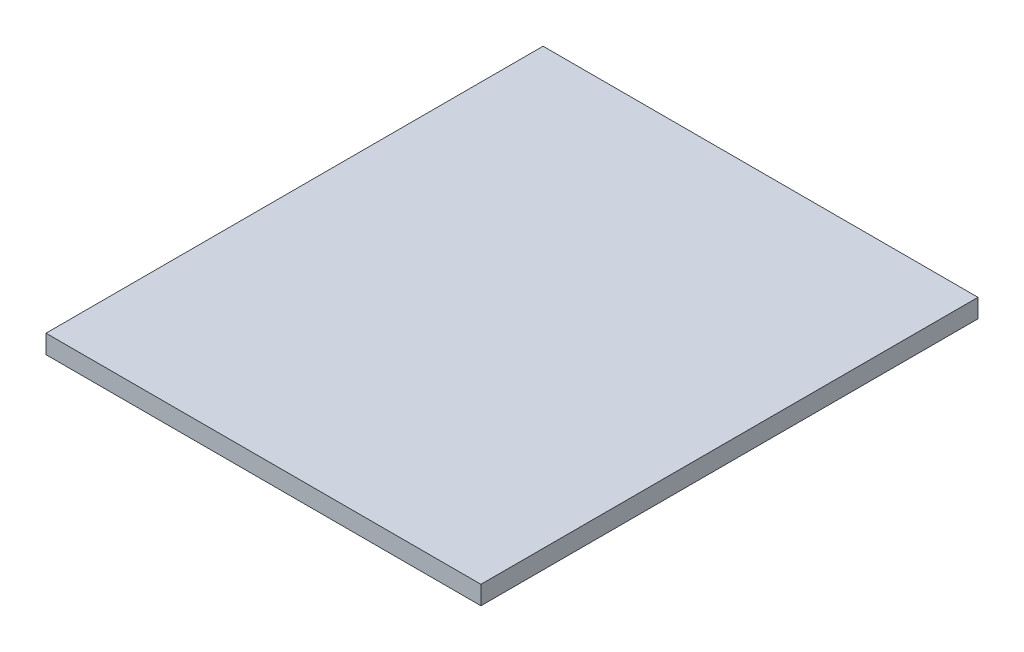
ISO-10303-21;
HEADER;
FILE_DESCRIPTION(('STEP AP214'),'2;1');
FILE_NAME('part.step','',(''),(''),'','','');
FILE_SCHEMA(('AUTOMOTIVE_DESIGN { 1 0 10303 214 1 1 1 1 }'));
ENDSEC;
DATA;
#1=APPLICATION_CONTEXT('core data for automotive mechanical design processes');
#2=APPLICATION_PROTOCOL_DEFINITION('international standard','automotive_design',2000,#1);
#3=PRODUCT_CONTEXT('',#1,'mechanical');
#4=PRODUCT('Part','Part','',(#3));
#5=PRODUCT_RELATED_PRODUCT_CATEGORY('part','',(#4));
#6=PRODUCT_DEFINITION_FORMATION('','',#4);
#7=PRODUCT_DEFINITION_CONTEXT('part definition',#1,'design');
#8=PRODUCT_DEFINITION('design','',#6,#7);
#9=PRODUCT_DEFINITION_SHAPE('','',#8);
#10=(LENGTH_UNIT() NAMED_UNIT(*) SI_UNIT(.MILLI.,.METRE.));
#11=(NAMED_UNIT(*) PLANE_ANGLE_UNIT() SI_UNIT($,.RADIAN.));
#12=(NAMED_UNIT(*) SI_UNIT($,.STERADIAN.) SOLID_ANGLE_UNIT());
#13=UNCERTAINTY_MEASURE_WITH_UNIT(LENGTH_MEASURE(1.E-05),#10,'distance_accuracy_value','');
#14=(GEOMETRIC_REPRESENTATION_CONTEXT(3) GLOBAL_UNCERTAINTY_ASSIGNED_CONTEXT((#13)) GLOBAL_UNIT_ASSIGNED_CONTEXT((#10,
#11,#12)) REPRESENTATION_CONTEXT('',''));
#15=CARTESIAN_POINT('',(0.,0.,0.));
#16=DIRECTION('',(0.,0.,1.));
#17=DIRECTION('',(1.,0.,0.));
#18=AXIS2_PLACEMENT_3D('',#15,#16,#17);
#19=CARTESIAN_POINT('',(-35.,3.,40.));
#20=DIRECTION('',(0.,0.,-1.));
#21=DIRECTION('',(-1.,0.,0.));
#22=AXIS2_PLACEMENT_3D('',#19,#20,#21);
#23=PLANE('',#22);
#24=DIRECTION('',(1.,0.,0.));
#25=VECTOR('',#24,1.);
#26=CARTESIAN_POINT('',(-35.,0.,40.));
#27=LINE('',#26,#25);
#28=CARTESIAN_POINT('',(-35.,0.,40.));
#29=VERTEX_POINT('',#28);
#30=CARTESIAN_POINT('',(35.,0.,40.));
#31=VERTEX_POINT('',#30);
#32=EDGE_CURVE('E96',#29,#31,#27,.T.);
#33=ORIENTED_EDGE('',*,*,#32,.T.);
#34=DIRECTION('',(0.,-1.,0.));
#35=VECTOR('',#34,1.);
#36=CARTESIAN_POINT('',(35.,3.,40.));
#37=LINE('',#36,#35);
#38=CARTESIAN_POINT('',(35.,3.,40.));
#39=VERTEX_POINT('',#38);
#40=EDGE_CURVE('E11',#39,#31,#37,.T.);
#41=ORIENTED_EDGE('',*,*,#40,.F.);
#42=DIRECTION('',(1.,0.,0.));
#43=VECTOR('',#42,1.);
#44=CARTESIAN_POINT('',(-35.,3.,40.));
#45=LINE('',#44,#43);
#46=CARTESIAN_POINT('',(-35.,3.,40.));
#47=VERTEX_POINT('',#46);
#48=EDGE_CURVE('E82',#47,#39,#45,.T.);
#49=ORIENTED_EDGE('',*,*,#48,.F.);
#50=DIRECTION('',(0.,-1.,0.));
#51=VECTOR('',#50,1.);
#52=CARTESIAN_POINT('',(-35.,3.,40.));
#53=LINE('',#52,#51);
#54=EDGE_CURVE('E49',#47,#29,#53,.T.);
#55=ORIENTED_EDGE('',*,*,#54,.T.);
#56=EDGE_LOOP('',(#33,#41,#49,#55));
#57=FACE_BOUND('',#56,.T.);
#58=ADVANCED_FACE('F33',(#57),#23,.F.);
#59=CARTESIAN_POINT('',(35.,3.,40.));
#60=DIRECTION('',(-1.,0.,0.));
#61=DIRECTION('',(0.,0.,1.));
#62=AXIS2_PLACEMENT_3D('',#59,#60,#61);
#63=PLANE('',#62);
#64=DIRECTION('',(0.,0.,-1.));
#65=VECTOR('',#64,1.);
#66=CARTESIAN_POINT('',(35.,0.,40.));
#67=LINE('',#66,#65);
#68=CARTESIAN_POINT('',(35.,0.,-40.));
#69=VERTEX_POINT('',#68);
#70=EDGE_CURVE('E87',#31,#69,#67,.T.);
#71=ORIENTED_EDGE('',*,*,#70,.T.);
#72=DIRECTION('',(0.,-1.,0.));
#73=VECTOR('',#72,1.);
#74=CARTESIAN_POINT('',(35.,3.,-40.));
#75=LINE('',#74,#73);
#76=CARTESIAN_POINT('',(35.,3.,-40.));
#77=VERTEX_POINT('',#76);
#78=EDGE_CURVE('E41',#77,#69,#75,.T.);
#79=ORIENTED_EDGE('',*,*,#78,.F.);
#80=DIRECTION('',(0.,0.,-1.));
#81=VECTOR('',#80,1.);
#82=CARTESIAN_POINT('',(35.,3.,40.));
#83=LINE('',#82,#81);
#84=EDGE_CURVE('E74',#39,#77,#83,.T.);
#85=ORIENTED_EDGE('',*,*,#84,.F.);
#86=ORIENTED_EDGE('',*,*,#40,.T.);
#87=EDGE_LOOP('',(#71,#79,#85,#86));
#88=FACE_BOUND('',#87,.T.);
#89=ADVANCED_FACE('F86',(#88),#63,.F.);
#90=CARTESIAN_POINT('',(-35.,3.,-40.));
#91=DIRECTION('',(0.,0.,-1.));
#92=DIRECTION('',(-1.,0.,0.));
#93=AXIS2_PLACEMENT_3D('',#90,#91,#92);
#94=PLANE('',#93);
#95=DIRECTION('',(1.,0.,0.));
#96=VECTOR('',#95,1.);
#97=CARTESIAN_POINT('',(-35.,0.,-40.));
#98=LINE('',#97,#96);
#99=CARTESIAN_POINT('',(-35.,0.,-40.));
#100=VERTEX_POINT('',#99);
#101=EDGE_CURVE('E99',#100,#69,#98,.T.);
#102=ORIENTED_EDGE('',*,*,#101,.F.);
#103=DIRECTION('',(0.,-1.,0.));
#104=VECTOR('',#103,1.);
#105=CARTESIAN_POINT('',(-35.,3.,-40.));
#106=LINE('',#105,#104);
#107=CARTESIAN_POINT('',(-35.,3.,-40.));
#108=VERTEX_POINT('',#107);
#109=EDGE_CURVE('E63',#108,#100,#106,.T.);
#110=ORIENTED_EDGE('',*,*,#109,.F.);
#111=DIRECTION('',(1.,0.,0.));
#112=VECTOR('',#111,1.);
#113=CARTESIAN_POINT('',(-35.,3.,-40.));
#114=LINE('',#113,#112);
#115=EDGE_CURVE('E81',#108,#77,#114,.T.);
#116=ORIENTED_EDGE('',*,*,#115,.T.);
#117=ORIENTED_EDGE('',*,*,#78,.T.);
#118=EDGE_LOOP('',(#102,#110,#116,#117));
#119=FACE_BOUND('',#118,.T.);
#120=ADVANCED_FACE('F90',(#119),#94,.T.);
#121=CARTESIAN_POINT('',(-35.,3.,40.));
#122=DIRECTION('',(-1.,0.,0.));
#123=DIRECTION('',(0.,0.,1.));
#124=AXIS2_PLACEMENT_3D('',#121,#122,#123);
#125=PLANE('',#124);
#126=DIRECTION('',(0.,0.,-1.));
#127=VECTOR('',#126,1.);
#128=CARTESIAN_POINT('',(-35.,0.,40.));
#129=LINE('',#128,#127);
#130=EDGE_CURVE('E101',#29,#100,#129,.T.);
#131=ORIENTED_EDGE('',*,*,#130,.F.);
#132=ORIENTED_EDGE('',*,*,#54,.F.);
#133=DIRECTION('',(0.,0.,-1.));
#134=VECTOR('',#133,1.);
#135=CARTESIAN_POINT('',(-35.,3.,40.));
#136=LINE('',#135,#134);
#137=EDGE_CURVE('E91',#47,#108,#136,.T.);
#138=ORIENTED_EDGE('',*,*,#137,.T.);
#139=ORIENTED_EDGE('',*,*,#109,.T.);
#140=EDGE_LOOP('',(#131,#132,#138,#139));
#141=FACE_BOUND('',#140,.T.);
#142=ADVANCED_FACE('F107',(#141),#125,.T.);
#143=CARTESIAN_POINT('',(0.,3.,0.));
#144=DIRECTION('',(0.,1.,0.));
#145=DIRECTION('',(0.,0.,1.));
#146=AXIS2_PLACEMENT_3D('',#143,#144,#145);
#147=PLANE('',#146);
#148=ORIENTED_EDGE('',*,*,#48,.T.);
#149=ORIENTED_EDGE('',*,*,#84,.T.);
#150=ORIENTED_EDGE('',*,*,#115,.F.);
#151=ORIENTED_EDGE('',*,*,#137,.F.);
#152=EDGE_LOOP('',(#148,#149,#150,#151));
#153=FACE_BOUND('',#152,.T.);
#154=ADVANCED_FACE('F78',(#153),#147,.T.);
#155=CARTESIAN_POINT('',(0.,0.,0.));
#156=DIRECTION('',(0.,1.,0.));
#157=DIRECTION('',(0.,0.,1.));
#158=AXIS2_PLACEMENT_3D('',#155,#156,#157);
#159=PLANE('',#158);
#160=ORIENTED_EDGE('',*,*,#32,.F.);
#161=ORIENTED_EDGE('',*,*,#130,.T.);
#162=ORIENTED_EDGE('',*,*,#101,.T.);
#163=ORIENTED_EDGE('',*,*,#70,.F.);
#164=EDGE_LOOP('',(#160,#161,#162,#163));
#165=FACE_BOUND('',#164,.T.);
#166=ADVANCED_FACE('F106',(#165),#159,.F.);
#167=CLOSED_SHELL('',(#58,#89,#120,#142,#154,#166));
#168=MANIFOLD_SOLID_BREP('B2',#167);
#169=ADVANCED_BREP_SHAPE_REPRESENTATION('',(#18,#168),#14);
#170=SHAPE_DEFINITION_REPRESENTATION(#9,#169);
ENDSEC;
END-ISO-10303-21;
